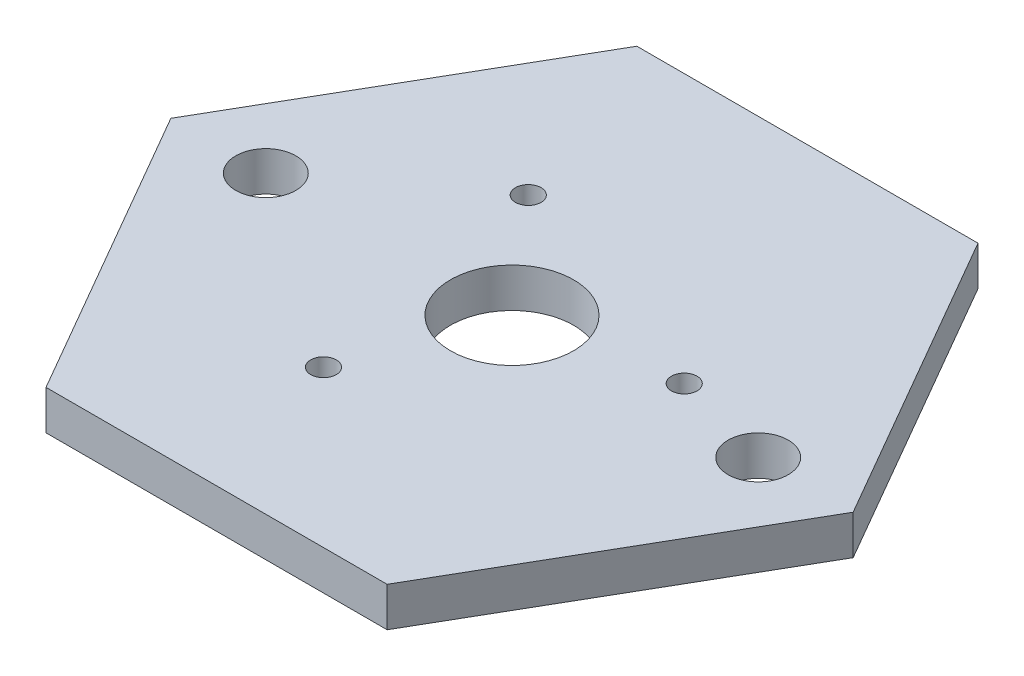
ISO-10303-21;
HEADER;
FILE_DESCRIPTION(('STEP AP214'),'2;1');
FILE_NAME('part.step','',(''),(''),'','','');
FILE_SCHEMA(('AUTOMOTIVE_DESIGN { 1 0 10303 214 1 1 1 1 }'));
ENDSEC;
DATA;
#1=APPLICATION_CONTEXT('core data for automotive mechanical design processes');
#2=APPLICATION_PROTOCOL_DEFINITION('international standard','automotive_design',2000,#1);
#3=PRODUCT_CONTEXT('',#1,'mechanical');
#4=PRODUCT('Part','Part','',(#3));
#5=PRODUCT_RELATED_PRODUCT_CATEGORY('part','',(#4));
#6=PRODUCT_DEFINITION_FORMATION('','',#4);
#7=PRODUCT_DEFINITION_CONTEXT('part definition',#1,'design');
#8=PRODUCT_DEFINITION('design','',#6,#7);
#9=PRODUCT_DEFINITION_SHAPE('','',#8);
#10=(LENGTH_UNIT() NAMED_UNIT(*) SI_UNIT(.MILLI.,.METRE.));
#11=(NAMED_UNIT(*) PLANE_ANGLE_UNIT() SI_UNIT($,.RADIAN.));
#12=(NAMED_UNIT(*) SI_UNIT($,.STERADIAN.) SOLID_ANGLE_UNIT());
#13=UNCERTAINTY_MEASURE_WITH_UNIT(LENGTH_MEASURE(1.E-05),#10,'distance_accuracy_value','');
#14=(GEOMETRIC_REPRESENTATION_CONTEXT(3) GLOBAL_UNCERTAINTY_ASSIGNED_CONTEXT((#13)) GLOBAL_UNIT_ASSIGNED_CONTEXT((#10,
#11,#12)) REPRESENTATION_CONTEXT('',''));
#15=CARTESIAN_POINT('',(0.,0.,0.));
#16=DIRECTION('',(0.,0.,1.));
#17=DIRECTION('',(1.,0.,0.));
#18=AXIS2_PLACEMENT_3D('',#15,#16,#17);
#19=CARTESIAN_POINT('',(29.4948974278318,0.,-5.48188158588629));
#20=DIRECTION('',(0.,1.,0.));
#21=DIRECTION('',(0.,0.,1.));
#22=AXIS2_PLACEMENT_3D('',#19,#20,#21);
#23=CYLINDRICAL_SURFACE('',#22,2.6);
#24=CARTESIAN_POINT('',(29.4948974278318,8.,-5.48188158588629));
#25=DIRECTION('',(0.,1.,0.));
#26=DIRECTION('',(0.,0.,1.));
#27=AXIS2_PLACEMENT_3D('',#24,#25,#26);
#28=CIRCLE('',#27,2.6);
#29=CARTESIAN_POINT('',(29.4948974278318,8.,-2.88188158588629));
#30=VERTEX_POINT('',#29);
#31=EDGE_CURVE('E168',#30,#30,#28,.T.);
#32=ORIENTED_EDGE('',*,*,#31,.T.);
#33=EDGE_LOOP('',(#32));
#34=FACE_BOUND('',#33,.T.);
#35=CARTESIAN_POINT('',(29.4948974278318,1.5,-5.48188158588629));
#36=DIRECTION('',(0.,-1.,0.));
#37=DIRECTION('',(0.,0.,-1.));
#38=AXIS2_PLACEMENT_3D('',#35,#36,#37);
#39=CIRCLE('',#38,2.6);
#40=CARTESIAN_POINT('',(29.4948974278318,1.5,-8.08188158588629));
#41=VERTEX_POINT('',#40);
#42=EDGE_CURVE('E42',#41,#41,#39,.F.);
#43=ORIENTED_EDGE('',*,*,#42,.F.);
#44=EDGE_LOOP('',(#43));
#45=FACE_BOUND('',#44,.T.);
#46=ADVANCED_FACE('F38',(#34,#45),#23,.F.);
#47=CARTESIAN_POINT('',(-19.4948974278317,0.,-22.8023896615754));
#48=DIRECTION('',(0.,1.,0.));
#49=DIRECTION('',(0.,0.,1.));
#50=AXIS2_PLACEMENT_3D('',#47,#48,#49);
#51=CYLINDRICAL_SURFACE('',#50,2.6);
#52=CARTESIAN_POINT('',(-19.4948974278317,8.,-22.8023896615754));
#53=DIRECTION('',(0.,1.,0.));
#54=DIRECTION('',(0.,0.,1.));
#55=AXIS2_PLACEMENT_3D('',#52,#53,#54);
#56=CIRCLE('',#55,2.6);
#57=CARTESIAN_POINT('',(-19.4948974278317,8.,-20.2023896615754));
#58=VERTEX_POINT('',#57);
#59=EDGE_CURVE('E173',#58,#58,#56,.T.);
#60=ORIENTED_EDGE('',*,*,#59,.T.);
#61=EDGE_LOOP('',(#60));
#62=FACE_BOUND('',#61,.T.);
#63=CARTESIAN_POINT('',(-19.4948974278317,1.5,-22.8023896615754));
#64=DIRECTION('',(0.,-1.,0.));
#65=DIRECTION('',(0.,0.,-1.));
#66=AXIS2_PLACEMENT_3D('',#63,#64,#65);
#67=CIRCLE('',#66,2.6);
#68=CARTESIAN_POINT('',(-19.4948974278317,1.5,-25.4023896615754));
#69=VERTEX_POINT('',#68);
#70=EDGE_CURVE('E160',#69,#69,#67,.F.);
#71=ORIENTED_EDGE('',*,*,#70,.F.);
#72=EDGE_LOOP('',(#71));
#73=FACE_BOUND('',#72,.T.);
#74=ADVANCED_FACE('F280',(#62,#73),#51,.F.);
#75=CARTESIAN_POINT('',(-10.,0.,28.2842712474619));
#76=DIRECTION('',(0.,1.,0.));
#77=DIRECTION('',(0.,0.,1.));
#78=AXIS2_PLACEMENT_3D('',#75,#76,#77);
#79=CYLINDRICAL_SURFACE('',#78,2.6);
#80=CARTESIAN_POINT('',(-10.,8.,28.2842712474619));
#81=DIRECTION('',(0.,1.,0.));
#82=DIRECTION('',(0.,0.,1.));
#83=AXIS2_PLACEMENT_3D('',#80,#81,#82);
#84=CIRCLE('',#83,2.6);
#85=CARTESIAN_POINT('',(-10.,8.,30.8842712474619));
#86=VERTEX_POINT('',#85);
#87=EDGE_CURVE('E179',#86,#86,#84,.T.);
#88=ORIENTED_EDGE('',*,*,#87,.T.);
#89=EDGE_LOOP('',(#88));
#90=FACE_BOUND('',#89,.T.);
#91=CARTESIAN_POINT('',(-10.,1.5,28.2842712474619));
#92=DIRECTION('',(0.,-1.,0.));
#93=DIRECTION('',(0.,0.,-1.));
#94=AXIS2_PLACEMENT_3D('',#91,#92,#93);
#95=CIRCLE('',#94,2.6);
#96=CARTESIAN_POINT('',(-10.,1.5,25.6842712474619));
#97=VERTEX_POINT('',#96);
#98=EDGE_CURVE('E157',#97,#97,#95,.F.);
#99=ORIENTED_EDGE('',*,*,#98,.F.);
#100=EDGE_LOOP('',(#99));
#101=FACE_BOUND('',#100,.T.);
#102=ADVANCED_FACE('F286',(#90,#101),#79,.F.);
#103=CARTESIAN_POINT('',(34.6410161513781,8.,59.9999999999994));
#104=DIRECTION('',(-0.866025403784441,0.,-0.499999999999995));
#105=DIRECTION('',(-0.499999999999995,0.,0.866025403784442));
#106=AXIS2_PLACEMENT_3D('',#103,#104,#105);
#107=PLANE('',#106);
#108=DIRECTION('',(0.499999999999995,0.,-0.866025403784441));
#109=VECTOR('',#108,1.);
#110=CARTESIAN_POINT('',(34.6410161513781,0.,59.9999999999994));
#111=LINE('',#110,#109);
#112=CARTESIAN_POINT('',(34.6410161513781,0.,59.9999999999994));
#113=VERTEX_POINT('',#112);
#114=CARTESIAN_POINT('',(69.2820323027548,0.,0.));
#115=VERTEX_POINT('',#114);
#116=EDGE_CURVE('E130',#113,#115,#111,.T.);
#117=ORIENTED_EDGE('',*,*,#116,.T.);
#118=DIRECTION('',(0.,-1.,0.));
#119=VECTOR('',#118,1.);
#120=CARTESIAN_POINT('',(69.2820323027548,8.,0.));
#121=LINE('',#120,#119);
#122=CARTESIAN_POINT('',(69.2820323027548,8.,0.));
#123=VERTEX_POINT('',#122);
#124=EDGE_CURVE('E11',#123,#115,#121,.T.);
#125=ORIENTED_EDGE('',*,*,#124,.F.);
#126=DIRECTION('',(0.499999999999995,0.,-0.866025403784441));
#127=VECTOR('',#126,1.);
#128=CARTESIAN_POINT('',(34.6410161513781,8.,59.9999999999994));
#129=LINE('',#128,#127);
#130=CARTESIAN_POINT('',(34.6410161513781,8.,59.9999999999994));
#131=VERTEX_POINT('',#130);
#132=EDGE_CURVE('E147',#131,#123,#129,.T.);
#133=ORIENTED_EDGE('',*,*,#132,.F.);
#134=DIRECTION('',(0.,-1.,0.));
#135=VECTOR('',#134,1.);
#136=CARTESIAN_POINT('',(34.6410161513781,8.,59.9999999999994));
#137=LINE('',#136,#135);
#138=EDGE_CURVE('E126',#131,#113,#137,.T.);
#139=ORIENTED_EDGE('',*,*,#138,.T.);
#140=EDGE_LOOP('',(#117,#125,#133,#139));
#141=FACE_BOUND('',#140,.T.);
#142=ADVANCED_FACE('F40',(#141),#107,.F.);
#143=CARTESIAN_POINT('',(69.2820323027548,8.,0.));
#144=DIRECTION('',(-0.866025403784438,0.,0.500000000000001));
#145=DIRECTION('',(0.500000000000001,0.,0.866025403784438));
#146=AXIS2_PLACEMENT_3D('',#143,#144,#145);
#147=PLANE('',#146);
#148=DIRECTION('',(-0.500000000000001,0.,-0.866025403784438));
#149=VECTOR('',#148,1.);
#150=CARTESIAN_POINT('',(69.2820323027548,0.,0.));
#151=LINE('',#150,#149);
#152=CARTESIAN_POINT('',(34.6410161513773,0.,-59.9999999999999));
#153=VERTEX_POINT('',#152);
#154=EDGE_CURVE('E134',#115,#153,#151,.T.);
#155=ORIENTED_EDGE('',*,*,#154,.T.);
#156=DIRECTION('',(0.,-1.,0.));
#157=VECTOR('',#156,1.);
#158=CARTESIAN_POINT('',(34.6410161513773,8.,-59.9999999999999));
#159=LINE('',#158,#157);
#160=CARTESIAN_POINT('',(34.6410161513773,8.,-59.9999999999999));
#161=VERTEX_POINT('',#160);
#162=EDGE_CURVE('E49',#161,#153,#159,.T.);
#163=ORIENTED_EDGE('',*,*,#162,.F.);
#164=DIRECTION('',(-0.500000000000001,0.,-0.866025403784438));
#165=VECTOR('',#164,1.);
#166=CARTESIAN_POINT('',(69.2820323027548,8.,0.));
#167=LINE('',#166,#165);
#168=EDGE_CURVE('E95',#123,#161,#167,.T.);
#169=ORIENTED_EDGE('',*,*,#168,.F.);
#170=ORIENTED_EDGE('',*,*,#124,.T.);
#171=EDGE_LOOP('',(#155,#163,#169,#170));
#172=FACE_BOUND('',#171,.T.);
#173=ADVANCED_FACE('F430',(#172),#147,.F.);
#174=CARTESIAN_POINT('',(34.6410161513773,8.,-59.9999999999999));
#175=DIRECTION('',(0.,0.,1.));
#176=DIRECTION('',(1.,0.,0.));
#177=AXIS2_PLACEMENT_3D('',#174,#175,#176);
#178=PLANE('',#177);
#179=DIRECTION('',(-1.,0.,0.));
#180=VECTOR('',#179,1.);
#181=CARTESIAN_POINT('',(34.6410161513773,0.,-59.9999999999999));
#182=LINE('',#181,#180);
#183=CARTESIAN_POINT('',(-34.6410161513777,0.,-59.9999999999996));
#184=VERTEX_POINT('',#183);
#185=EDGE_CURVE('E138',#153,#184,#182,.T.);
#186=ORIENTED_EDGE('',*,*,#185,.T.);
#187=DIRECTION('',(0.,-1.,0.));
#188=VECTOR('',#187,1.);
#189=CARTESIAN_POINT('',(-34.6410161513777,8.,-59.9999999999996));
#190=LINE('',#189,#188);
#191=CARTESIAN_POINT('',(-34.6410161513777,8.,-59.9999999999996));
#192=VERTEX_POINT('',#191);
#193=EDGE_CURVE('E119',#192,#184,#190,.T.);
#194=ORIENTED_EDGE('',*,*,#193,.F.);
#195=DIRECTION('',(-1.,0.,0.));
#196=VECTOR('',#195,1.);
#197=CARTESIAN_POINT('',(34.6410161513773,8.,-59.9999999999999));
#198=LINE('',#197,#196);
#199=EDGE_CURVE('E108',#161,#192,#198,.T.);
#200=ORIENTED_EDGE('',*,*,#199,.F.);
#201=ORIENTED_EDGE('',*,*,#162,.T.);
#202=EDGE_LOOP('',(#186,#194,#200,#201));
#203=FACE_BOUND('',#202,.T.);
#204=ADVANCED_FACE('F422',(#203),#178,.F.);
#205=CARTESIAN_POINT('',(-34.6410161513777,8.,-59.9999999999996));
#206=DIRECTION('',(0.866025403784441,0.,0.499999999999995));
#207=DIRECTION('',(0.499999999999995,0.,-0.866025403784442));
#208=AXIS2_PLACEMENT_3D('',#205,#206,#207);
#209=PLANE('',#208);
#210=DIRECTION('',(-0.499999999999995,0.,0.866025403784442));
#211=VECTOR('',#210,1.);
#212=CARTESIAN_POINT('',(-34.6410161513777,0.,-59.9999999999996));
#213=LINE('',#212,#211);
#214=CARTESIAN_POINT('',(-69.2820323027548,0.,4.83793845804391E-13));
#215=VERTEX_POINT('',#214);
#216=EDGE_CURVE('E117',#184,#215,#213,.T.);
#217=ORIENTED_EDGE('',*,*,#216,.T.);
#218=DIRECTION('',(0.,-1.,0.));
#219=VECTOR('',#218,1.);
#220=CARTESIAN_POINT('',(-69.2820323027548,8.,4.83793845804391E-13));
#221=LINE('',#220,#219);
#222=CARTESIAN_POINT('',(-69.2820323027548,8.,4.83793845804391E-13));
#223=VERTEX_POINT('',#222);
#224=EDGE_CURVE('E114',#223,#215,#221,.T.);
#225=ORIENTED_EDGE('',*,*,#224,.F.);
#226=DIRECTION('',(-0.499999999999995,0.,0.866025403784442));
#227=VECTOR('',#226,1.);
#228=CARTESIAN_POINT('',(-34.6410161513777,8.,-59.9999999999996));
#229=LINE('',#228,#227);
#230=EDGE_CURVE('E102',#192,#223,#229,.T.);
#231=ORIENTED_EDGE('',*,*,#230,.F.);
#232=ORIENTED_EDGE('',*,*,#193,.T.);
#233=EDGE_LOOP('',(#217,#225,#231,#232));
#234=FACE_BOUND('',#233,.T.);
#235=ADVANCED_FACE('F115',(#234),#209,.F.);
#236=CARTESIAN_POINT('',(-69.2820323027548,8.,4.83793845804391E-13));
#237=DIRECTION('',(0.866025403784434,0.,-0.500000000000007));
#238=DIRECTION('',(-0.500000000000007,0.,-0.866025403784434));
#239=AXIS2_PLACEMENT_3D('',#236,#237,#238);
#240=PLANE('',#239);
#241=DIRECTION('',(0.500000000000007,0.,0.866025403784434));
#242=VECTOR('',#241,1.);
#243=CARTESIAN_POINT('',(-69.2820323027548,0.,4.83793845804391E-13));
#244=LINE('',#243,#242);
#245=CARTESIAN_POINT('',(-34.6410161513769,0.,60.0000000000001));
#246=VERTEX_POINT('',#245);
#247=EDGE_CURVE('E81',#215,#246,#244,.T.);
#248=ORIENTED_EDGE('',*,*,#247,.T.);
#249=DIRECTION('',(0.,-1.,0.));
#250=VECTOR('',#249,1.);
#251=CARTESIAN_POINT('',(-34.6410161513769,8.,60.0000000000001));
#252=LINE('',#251,#250);
#253=CARTESIAN_POINT('',(-34.6410161513769,8.,60.0000000000001));
#254=VERTEX_POINT('',#253);
#255=EDGE_CURVE('E120',#254,#246,#252,.T.);
#256=ORIENTED_EDGE('',*,*,#255,.F.);
#257=DIRECTION('',(0.500000000000007,0.,0.866025403784434));
#258=VECTOR('',#257,1.);
#259=CARTESIAN_POINT('',(-69.2820323027548,8.,4.83793845804391E-13));
#260=LINE('',#259,#258);
#261=EDGE_CURVE('E106',#223,#254,#260,.T.);
#262=ORIENTED_EDGE('',*,*,#261,.F.);
#263=ORIENTED_EDGE('',*,*,#224,.T.);
#264=EDGE_LOOP('',(#248,#256,#262,#263));
#265=FACE_BOUND('',#264,.T.);
#266=ADVANCED_FACE('F122',(#265),#240,.F.);
#267=CARTESIAN_POINT('',(-34.6410161513769,8.,60.0000000000001));
#268=DIRECTION('',(0.,0.,-1.));
#269=DIRECTION('',(-1.,0.,0.));
#270=AXIS2_PLACEMENT_3D('',#267,#268,#269);
#271=PLANE('',#270);
#272=DIRECTION('',(1.,0.,0.));
#273=VECTOR('',#272,1.);
#274=CARTESIAN_POINT('',(-34.6410161513769,0.,60.0000000000001));
#275=LINE('',#274,#273);
#276=EDGE_CURVE('E87',#246,#113,#275,.T.);
#277=ORIENTED_EDGE('',*,*,#276,.T.);
#278=ORIENTED_EDGE('',*,*,#138,.F.);
#279=DIRECTION('',(1.,0.,0.));
#280=VECTOR('',#279,1.);
#281=CARTESIAN_POINT('',(-34.6410161513769,8.,60.0000000000001));
#282=LINE('',#281,#280);
#283=EDGE_CURVE('E58',#254,#131,#282,.T.);
#284=ORIENTED_EDGE('',*,*,#283,.F.);
#285=ORIENTED_EDGE('',*,*,#255,.T.);
#286=EDGE_LOOP('',(#277,#278,#284,#285));
#287=FACE_BOUND('',#286,.T.);
#288=ADVANCED_FACE('F269',(#287),#271,.F.);
#289=CARTESIAN_POINT('',(0.,8.,0.));
#290=DIRECTION('',(0.,1.,0.));
#291=DIRECTION('',(0.,0.,1.));
#292=AXIS2_PLACEMENT_3D('',#289,#290,#291);
#293=PLANE('',#292);
#294=ORIENTED_EDGE('',*,*,#87,.F.);
#295=EDGE_LOOP('',(#294));
#296=FACE_BOUND('',#295,.T.);
#297=ORIENTED_EDGE('',*,*,#59,.F.);
#298=EDGE_LOOP('',(#297));
#299=FACE_BOUND('',#298,.T.);
#300=ORIENTED_EDGE('',*,*,#31,.F.);
#301=EDGE_LOOP('',(#300));
#302=FACE_BOUND('',#301,.T.);
#303=CARTESIAN_POINT('',(0.,8.,0.));
#304=DIRECTION('',(0.,1.,0.));
#305=DIRECTION('',(0.,0.,1.));
#306=AXIS2_PLACEMENT_3D('',#303,#304,#305);
#307=CIRCLE('',#306,12.5);
#308=CARTESIAN_POINT('',(0.,8.,12.5));
#309=VERTEX_POINT('',#308);
#310=EDGE_CURVE('E188',#309,#309,#307,.T.);
#311=ORIENTED_EDGE('',*,*,#310,.F.);
#312=EDGE_LOOP('',(#311));
#313=FACE_BOUND('',#312,.T.);
#314=CARTESIAN_POINT('',(-50.,8.,0.));
#315=DIRECTION('',(0.,1.,0.));
#316=DIRECTION('',(0.,0.,1.));
#317=AXIS2_PLACEMENT_3D('',#314,#315,#316);
#318=CIRCLE('',#317,6.1);
#319=CARTESIAN_POINT('',(-50.,8.,6.1));
#320=VERTEX_POINT('',#319);
#321=EDGE_CURVE('E195',#320,#320,#318,.T.);
#322=ORIENTED_EDGE('',*,*,#321,.F.);
#323=EDGE_LOOP('',(#322));
#324=FACE_BOUND('',#323,.T.);
#325=CARTESIAN_POINT('',(50.,8.,0.));
#326=DIRECTION('',(0.,1.,0.));
#327=DIRECTION('',(0.,0.,1.));
#328=AXIS2_PLACEMENT_3D('',#325,#326,#327);
#329=CIRCLE('',#328,6.1);
#330=CARTESIAN_POINT('',(50.,8.,6.1));
#331=VERTEX_POINT('',#330);
#332=EDGE_CURVE('E187',#331,#331,#329,.T.);
#333=ORIENTED_EDGE('',*,*,#332,.F.);
#334=EDGE_LOOP('',(#333));
#335=FACE_BOUND('',#334,.T.);
#336=ORIENTED_EDGE('',*,*,#132,.T.);
#337=ORIENTED_EDGE('',*,*,#168,.T.);
#338=ORIENTED_EDGE('',*,*,#199,.T.);
#339=ORIENTED_EDGE('',*,*,#230,.T.);
#340=ORIENTED_EDGE('',*,*,#261,.T.);
#341=ORIENTED_EDGE('',*,*,#283,.T.);
#342=EDGE_LOOP('',(#336,#337,#338,#339,#340,#341));
#343=FACE_BOUND('',#342,.T.);
#344=ADVANCED_FACE('F104',(#296,#299,#302,#313,#324,#335,#343),#293,.T.);
#345=CARTESIAN_POINT('',(0.,0.,0.));
#346=DIRECTION('',(0.,1.,0.));
#347=DIRECTION('',(0.,0.,1.));
#348=AXIS2_PLACEMENT_3D('',#345,#346,#347);
#349=PLANE('',#348);
#350=CARTESIAN_POINT('',(-10.,0.,28.2842712474619));
#351=DIRECTION('',(0.,-1.,0.));
#352=DIRECTION('',(0.,0.,-1.));
#353=AXIS2_PLACEMENT_3D('',#350,#351,#352);
#354=CIRCLE('',#353,5.5);
#355=CARTESIAN_POINT('',(-10.,0.,22.7842712474619));
#356=VERTEX_POINT('',#355);
#357=EDGE_CURVE('E231',#356,#356,#354,.T.);
#358=ORIENTED_EDGE('',*,*,#357,.F.);
#359=EDGE_LOOP('',(#358));
#360=FACE_BOUND('',#359,.T.);
#361=CARTESIAN_POINT('',(-19.4948974278317,0.,-22.8023896615754));
#362=DIRECTION('',(0.,-1.,0.));
#363=DIRECTION('',(0.,0.,-1.));
#364=AXIS2_PLACEMENT_3D('',#361,#362,#363);
#365=CIRCLE('',#364,5.5);
#366=CARTESIAN_POINT('',(-19.4948974278317,0.,-28.3023896615754));
#367=VERTEX_POINT('',#366);
#368=EDGE_CURVE('E223',#367,#367,#365,.T.);
#369=ORIENTED_EDGE('',*,*,#368,.F.);
#370=EDGE_LOOP('',(#369));
#371=FACE_BOUND('',#370,.T.);
#372=CARTESIAN_POINT('',(29.4948974278318,0.,-5.48188158588629));
#373=DIRECTION('',(0.,-1.,0.));
#374=DIRECTION('',(0.,0.,-1.));
#375=AXIS2_PLACEMENT_3D('',#372,#373,#374);
#376=CIRCLE('',#375,5.5);
#377=CARTESIAN_POINT('',(29.4948974278318,0.,-10.9818815858863));
#378=VERTEX_POINT('',#377);
#379=EDGE_CURVE('E215',#378,#378,#376,.T.);
#380=ORIENTED_EDGE('',*,*,#379,.F.);
#381=EDGE_LOOP('',(#380));
#382=FACE_BOUND('',#381,.T.);
#383=CARTESIAN_POINT('',(0.,0.,0.));
#384=DIRECTION('',(0.,1.,0.));
#385=DIRECTION('',(0.,0.,1.));
#386=AXIS2_PLACEMENT_3D('',#383,#384,#385);
#387=CIRCLE('',#386,12.5);
#388=CARTESIAN_POINT('',(0.,0.,12.5));
#389=VERTEX_POINT('',#388);
#390=EDGE_CURVE('E183',#389,#389,#387,.T.);
#391=ORIENTED_EDGE('',*,*,#390,.T.);
#392=EDGE_LOOP('',(#391));
#393=FACE_BOUND('',#392,.T.);
#394=CARTESIAN_POINT('',(-50.,0.,0.));
#395=DIRECTION('',(0.,1.,0.));
#396=DIRECTION('',(0.,0.,1.));
#397=AXIS2_PLACEMENT_3D('',#394,#395,#396);
#398=CIRCLE('',#397,6.1);
#399=CARTESIAN_POINT('',(-50.,0.,6.1));
#400=VERTEX_POINT('',#399);
#401=EDGE_CURVE('E135',#400,#400,#398,.T.);
#402=ORIENTED_EDGE('',*,*,#401,.T.);
#403=EDGE_LOOP('',(#402));
#404=FACE_BOUND('',#403,.T.);
#405=CARTESIAN_POINT('',(50.,0.,0.));
#406=DIRECTION('',(0.,1.,0.));
#407=DIRECTION('',(0.,0.,1.));
#408=AXIS2_PLACEMENT_3D('',#405,#406,#407);
#409=CIRCLE('',#408,6.1);
#410=CARTESIAN_POINT('',(50.,0.,6.1));
#411=VERTEX_POINT('',#410);
#412=EDGE_CURVE('E199',#411,#411,#409,.T.);
#413=ORIENTED_EDGE('',*,*,#412,.T.);
#414=EDGE_LOOP('',(#413));
#415=FACE_BOUND('',#414,.T.);
#416=ORIENTED_EDGE('',*,*,#116,.F.);
#417=ORIENTED_EDGE('',*,*,#276,.F.);
#418=ORIENTED_EDGE('',*,*,#247,.F.);
#419=ORIENTED_EDGE('',*,*,#216,.F.);
#420=ORIENTED_EDGE('',*,*,#185,.F.);
#421=ORIENTED_EDGE('',*,*,#154,.F.);
#422=EDGE_LOOP('',(#416,#417,#418,#419,#420,#421));
#423=FACE_BOUND('',#422,.T.);
#424=ADVANCED_FACE('F249',(#360,#371,#382,#393,#404,#415,#423),#349,.F.);
#425=CARTESIAN_POINT('',(50.,0.,0.));
#426=DIRECTION('',(0.,1.,0.));
#427=DIRECTION('',(0.,0.,1.));
#428=AXIS2_PLACEMENT_3D('',#425,#426,#427);
#429=CYLINDRICAL_SURFACE('',#428,6.1);
#430=ORIENTED_EDGE('',*,*,#412,.F.);
#431=EDGE_LOOP('',(#430));
#432=FACE_BOUND('',#431,.T.);
#433=ORIENTED_EDGE('',*,*,#332,.T.);
#434=EDGE_LOOP('',(#433));
#435=FACE_BOUND('',#434,.T.);
#436=ADVANCED_FACE('F252',(#432,#435),#429,.F.);
#437=CARTESIAN_POINT('',(-50.,0.,0.));
#438=DIRECTION('',(0.,1.,0.));
#439=DIRECTION('',(0.,0.,1.));
#440=AXIS2_PLACEMENT_3D('',#437,#438,#439);
#441=CYLINDRICAL_SURFACE('',#440,6.1);
#442=ORIENTED_EDGE('',*,*,#401,.F.);
#443=EDGE_LOOP('',(#442));
#444=FACE_BOUND('',#443,.T.);
#445=ORIENTED_EDGE('',*,*,#321,.T.);
#446=EDGE_LOOP('',(#445));
#447=FACE_BOUND('',#446,.T.);
#448=ADVANCED_FACE('F295',(#444,#447),#441,.F.);
#449=CARTESIAN_POINT('',(0.,0.,0.));
#450=DIRECTION('',(0.,1.,0.));
#451=DIRECTION('',(0.,0.,1.));
#452=AXIS2_PLACEMENT_3D('',#449,#450,#451);
#453=CYLINDRICAL_SURFACE('',#452,12.5);
#454=ORIENTED_EDGE('',*,*,#390,.F.);
#455=EDGE_LOOP('',(#454));
#456=FACE_BOUND('',#455,.T.);
#457=ORIENTED_EDGE('',*,*,#310,.T.);
#458=EDGE_LOOP('',(#457));
#459=FACE_BOUND('',#458,.T.);
#460=ADVANCED_FACE('F292',(#456,#459),#453,.F.);
#461=CARTESIAN_POINT('',(-10.,1.5,28.2842712474619));
#462=DIRECTION('',(0.,-1.,0.));
#463=DIRECTION('',(0.,0.,-1.));
#464=AXIS2_PLACEMENT_3D('',#461,#462,#463);
#465=PLANE('',#464);
#466=CARTESIAN_POINT('',(-10.,1.5,28.2842712474619));
#467=DIRECTION('',(0.,-1.,0.));
#468=DIRECTION('',(0.,0.,-1.));
#469=AXIS2_PLACEMENT_3D('',#466,#467,#468);
#470=CIRCLE('',#469,5.5);
#471=CARTESIAN_POINT('',(-10.,1.5,22.7842712474619));
#472=VERTEX_POINT('',#471);
#473=EDGE_CURVE('E161',#472,#472,#470,.T.);
#474=ORIENTED_EDGE('',*,*,#473,.T.);
#475=EDGE_LOOP('',(#474));
#476=FACE_BOUND('',#475,.T.);
#477=ORIENTED_EDGE('',*,*,#98,.T.);
#478=EDGE_LOOP('',(#477));
#479=FACE_BOUND('',#478,.T.);
#480=ADVANCED_FACE('F239',(#476,#479),#465,.T.);
#481=CARTESIAN_POINT('',(-10.,1.5,28.2842712474619));
#482=DIRECTION('',(0.,-1.,0.));
#483=DIRECTION('',(0.,0.,-1.));
#484=AXIS2_PLACEMENT_3D('',#481,#482,#483);
#485=CYLINDRICAL_SURFACE('',#484,5.5);
#486=ORIENTED_EDGE('',*,*,#473,.F.);
#487=EDGE_LOOP('',(#486));
#488=FACE_BOUND('',#487,.T.);
#489=ORIENTED_EDGE('',*,*,#357,.T.);
#490=EDGE_LOOP('',(#489));
#491=FACE_BOUND('',#490,.T.);
#492=ADVANCED_FACE('F242',(#488,#491),#485,.F.);
#493=CARTESIAN_POINT('',(-19.4948974278317,1.5,-22.8023896615754));
#494=DIRECTION('',(0.,-1.,0.));
#495=DIRECTION('',(0.,0.,-1.));
#496=AXIS2_PLACEMENT_3D('',#493,#494,#495);
#497=PLANE('',#496);
#498=CARTESIAN_POINT('',(-19.4948974278317,1.5,-22.8023896615754));
#499=DIRECTION('',(0.,-1.,0.));
#500=DIRECTION('',(0.,0.,-1.));
#501=AXIS2_PLACEMENT_3D('',#498,#499,#500);
#502=CIRCLE('',#501,5.5);
#503=CARTESIAN_POINT('',(-19.4948974278317,1.5,-28.3023896615754));
#504=VERTEX_POINT('',#503);
#505=EDGE_CURVE('E227',#504,#504,#502,.T.);
#506=ORIENTED_EDGE('',*,*,#505,.T.);
#507=EDGE_LOOP('',(#506));
#508=FACE_BOUND('',#507,.T.);
#509=ORIENTED_EDGE('',*,*,#70,.T.);
#510=EDGE_LOOP('',(#509));
#511=FACE_BOUND('',#510,.T.);
#512=ADVANCED_FACE('F245',(#508,#511),#497,.T.);
#513=CARTESIAN_POINT('',(-19.4948974278317,1.5,-22.8023896615754));
#514=DIRECTION('',(0.,-1.,0.));
#515=DIRECTION('',(0.,0.,-1.));
#516=AXIS2_PLACEMENT_3D('',#513,#514,#515);
#517=CYLINDRICAL_SURFACE('',#516,5.5);
#518=ORIENTED_EDGE('',*,*,#505,.F.);
#519=EDGE_LOOP('',(#518));
#520=FACE_BOUND('',#519,.T.);
#521=ORIENTED_EDGE('',*,*,#368,.T.);
#522=EDGE_LOOP('',(#521));
#523=FACE_BOUND('',#522,.T.);
#524=ADVANCED_FACE('F349',(#520,#523),#517,.F.);
#525=CARTESIAN_POINT('',(29.4948974278318,1.5,-5.48188158588629));
#526=DIRECTION('',(0.,-1.,0.));
#527=DIRECTION('',(0.,0.,-1.));
#528=AXIS2_PLACEMENT_3D('',#525,#526,#527);
#529=PLANE('',#528);
#530=CARTESIAN_POINT('',(29.4948974278318,1.5,-5.48188158588629));
#531=DIRECTION('',(0.,-1.,0.));
#532=DIRECTION('',(0.,0.,-1.));
#533=AXIS2_PLACEMENT_3D('',#530,#531,#532);
#534=CIRCLE('',#533,5.5);
#535=CARTESIAN_POINT('',(29.4948974278318,1.5,-10.9818815858863));
#536=VERTEX_POINT('',#535);
#537=EDGE_CURVE('E219',#536,#536,#534,.T.);
#538=ORIENTED_EDGE('',*,*,#537,.T.);
#539=EDGE_LOOP('',(#538));
#540=FACE_BOUND('',#539,.T.);
#541=ORIENTED_EDGE('',*,*,#42,.T.);
#542=EDGE_LOOP('',(#541));
#543=FACE_BOUND('',#542,.T.);
#544=ADVANCED_FACE('F357',(#540,#543),#529,.T.);
#545=CARTESIAN_POINT('',(29.4948974278318,1.5,-5.48188158588629));
#546=DIRECTION('',(0.,-1.,0.));
#547=DIRECTION('',(0.,0.,-1.));
#548=AXIS2_PLACEMENT_3D('',#545,#546,#547);
#549=CYLINDRICAL_SURFACE('',#548,5.5);
#550=ORIENTED_EDGE('',*,*,#537,.F.);
#551=EDGE_LOOP('',(#550));
#552=FACE_BOUND('',#551,.T.);
#553=ORIENTED_EDGE('',*,*,#379,.T.);
#554=EDGE_LOOP('',(#553));
#555=FACE_BOUND('',#554,.T.);
#556=ADVANCED_FACE('F365',(#552,#555),#549,.F.);
#557=CLOSED_SHELL('',(#46,#74,#102,#142,#173,#204,#235,#266,#288,#344,#424,#436,#448,#460,#480,
#492,#512,#524,#544,#556));
#558=MANIFOLD_SOLID_BREP('B2',#557);
#559=ADVANCED_BREP_SHAPE_REPRESENTATION('',(#18,#558),#14);
#560=SHAPE_DEFINITION_REPRESENTATION(#9,#559);
ENDSEC;
END-ISO-10303-21;
